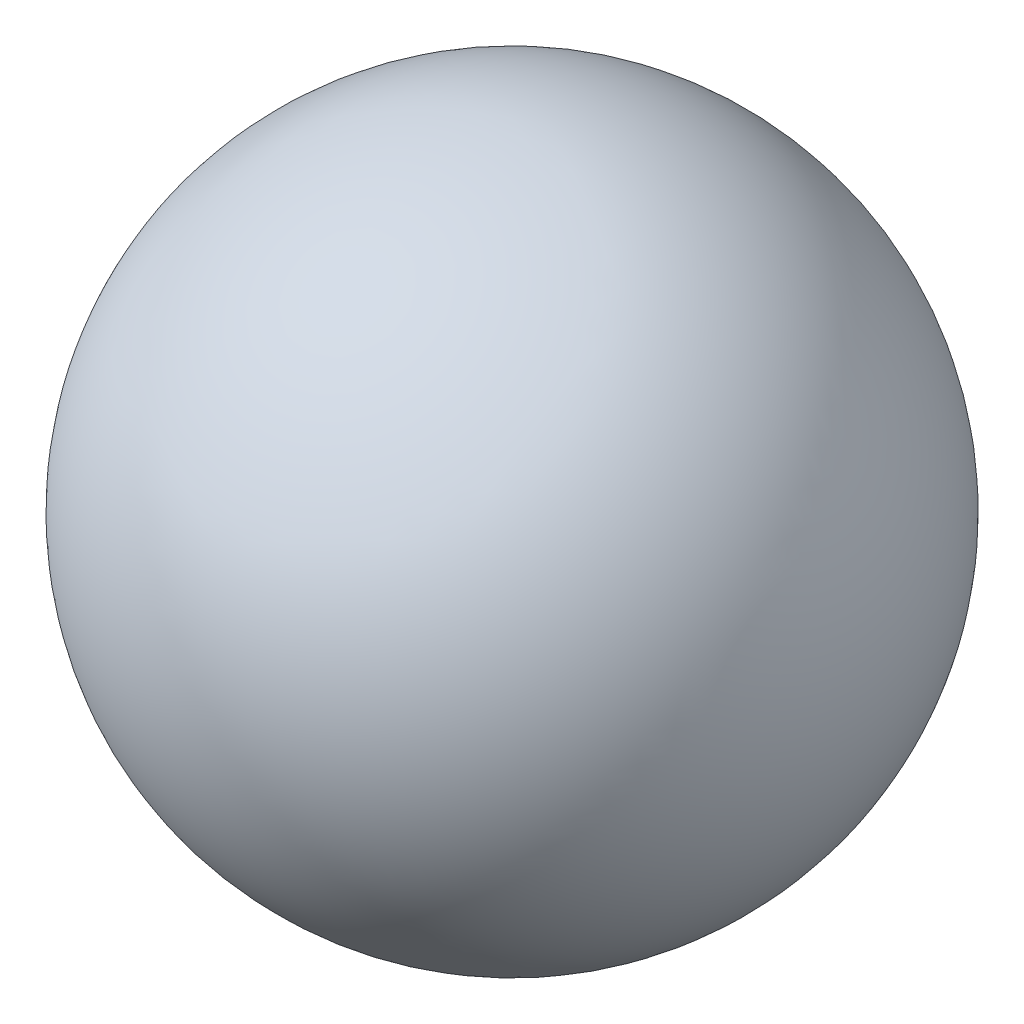
ISO-10303-21;
HEADER;
FILE_DESCRIPTION(('STEP AP214'),'2;1');
FILE_NAME('part.step','',(''),(''),'','','');
FILE_SCHEMA(('AUTOMOTIVE_DESIGN { 1 0 10303 214 1 1 1 1 }'));
ENDSEC;
DATA;
#1=APPLICATION_CONTEXT('core data for automotive mechanical design processes');
#2=APPLICATION_PROTOCOL_DEFINITION('international standard','automotive_design',2000,#1);
#3=PRODUCT_CONTEXT('',#1,'mechanical');
#4=PRODUCT('Part','Part','',(#3));
#5=PRODUCT_RELATED_PRODUCT_CATEGORY('part','',(#4));
#6=PRODUCT_DEFINITION_FORMATION('','',#4);
#7=PRODUCT_DEFINITION_CONTEXT('part definition',#1,'design');
#8=PRODUCT_DEFINITION('design','',#6,#7);
#9=PRODUCT_DEFINITION_SHAPE('','',#8);
#10=(LENGTH_UNIT() NAMED_UNIT(*) SI_UNIT(.MILLI.,.METRE.));
#11=(NAMED_UNIT(*) PLANE_ANGLE_UNIT() SI_UNIT($,.RADIAN.));
#12=(NAMED_UNIT(*) SI_UNIT($,.STERADIAN.) SOLID_ANGLE_UNIT());
#13=UNCERTAINTY_MEASURE_WITH_UNIT(LENGTH_MEASURE(1.E-05),#10,'distance_accuracy_value','');
#14=(GEOMETRIC_REPRESENTATION_CONTEXT(3) GLOBAL_UNCERTAINTY_ASSIGNED_CONTEXT((#13)) GLOBAL_UNIT_ASSIGNED_CONTEXT((#10,
#11,#12)) REPRESENTATION_CONTEXT('',''));
#15=CARTESIAN_POINT('',(0.,0.,0.));
#16=DIRECTION('',(0.,0.,1.));
#17=DIRECTION('',(1.,0.,0.));
#18=AXIS2_PLACEMENT_3D('',#15,#16,#17);
#19=CARTESIAN_POINT('',(0.,0.,0.));
#20=DIRECTION('',(1.,0.,0.));
#21=DIRECTION('',(0.,-1.,0.));
#22=AXIS2_PLACEMENT_3D('',#19,#20,#21);
#23=SPHERICAL_SURFACE('',#22,9.);
#24=CARTESIAN_POINT('',(9.,0.,0.));
#25=VERTEX_POINT('',#24);
#26=VERTEX_LOOP('',#25);
#27=FACE_BOUND('',#26,.T.);
#28=ADVANCED_FACE('F39',(#27),#23,.T.);
#29=CLOSED_SHELL('',(#28));
#30=MANIFOLD_SOLID_BREP('B2',#29);
#31=ADVANCED_BREP_SHAPE_REPRESENTATION('',(#18,#30),#14);
#32=SHAPE_DEFINITION_REPRESENTATION(#9,#31);
ENDSEC;
END-ISO-10303-21;
